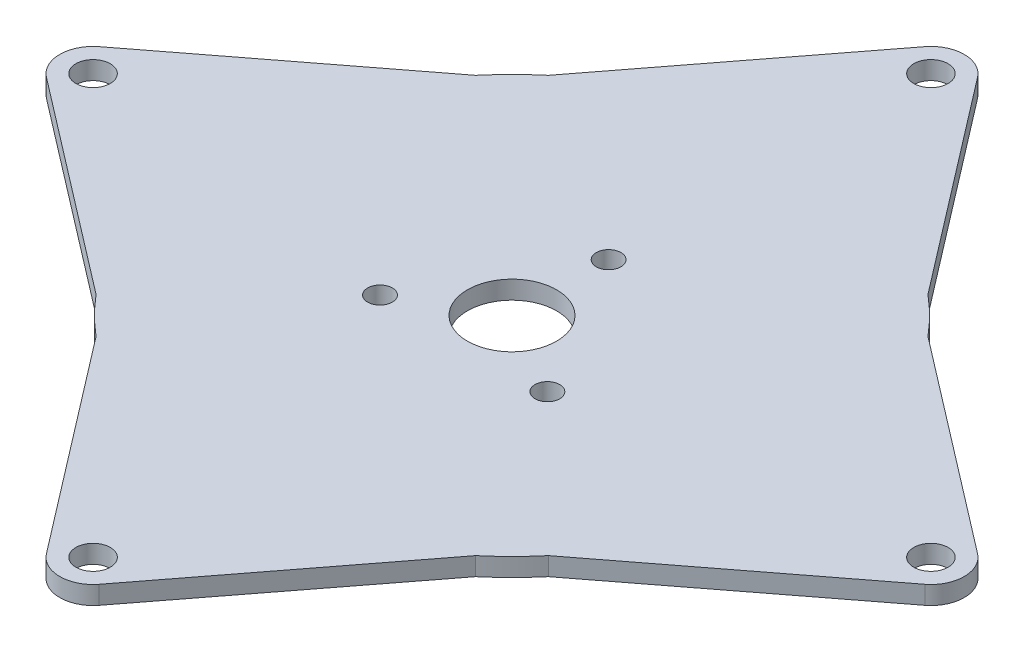
ISO-10303-21;
HEADER;
FILE_DESCRIPTION(('STEP AP214'),'2;1');
FILE_NAME('part.step','',(''),(''),'','','');
FILE_SCHEMA(('AUTOMOTIVE_DESIGN { 1 0 10303 214 1 1 1 1 }'));
ENDSEC;
DATA;
#1=APPLICATION_CONTEXT('core data for automotive mechanical design processes');
#2=APPLICATION_PROTOCOL_DEFINITION('international standard','automotive_design',2000,#1);
#3=PRODUCT_CONTEXT('',#1,'mechanical');
#4=PRODUCT('Part','Part','',(#3));
#5=PRODUCT_RELATED_PRODUCT_CATEGORY('part','',(#4));
#6=PRODUCT_DEFINITION_FORMATION('','',#4);
#7=PRODUCT_DEFINITION_CONTEXT('part definition',#1,'design');
#8=PRODUCT_DEFINITION('design','',#6,#7);
#9=PRODUCT_DEFINITION_SHAPE('','',#8);
#10=(LENGTH_UNIT() NAMED_UNIT(*) SI_UNIT(.MILLI.,.METRE.));
#11=(NAMED_UNIT(*) PLANE_ANGLE_UNIT() SI_UNIT($,.RADIAN.));
#12=(NAMED_UNIT(*) SI_UNIT($,.STERADIAN.) SOLID_ANGLE_UNIT());
#13=UNCERTAINTY_MEASURE_WITH_UNIT(LENGTH_MEASURE(1.E-05),#10,'distance_accuracy_value','');
#14=(GEOMETRIC_REPRESENTATION_CONTEXT(3) GLOBAL_UNCERTAINTY_ASSIGNED_CONTEXT((#13)) GLOBAL_UNIT_ASSIGNED_CONTEXT((#10,
#11,#12)) REPRESENTATION_CONTEXT('',''));
#15=CARTESIAN_POINT('',(0.,0.,0.));
#16=DIRECTION('',(0.,0.,1.));
#17=DIRECTION('',(1.,0.,0.));
#18=AXIS2_PLACEMENT_3D('',#15,#16,#17);
#19=CARTESIAN_POINT('',(21.3024503239143,1.7,-16.3370642064991));
#20=DIRECTION('',(0.793513081858033,0.,-0.60855319317227));
#21=DIRECTION('',(-0.60855319317227,0.,-0.793513081858033));
#22=AXIS2_PLACEMENT_3D('',#19,#20,#21);
#23=PLANE('',#22);
#24=DIRECTION('',(0.60855319317227,0.,0.793513081858033));
#25=VECTOR('',#24,1.);
#26=CARTESIAN_POINT('',(21.3024503239143,0.,-16.3370642064991));
#27=LINE('',#26,#25);
#28=CARTESIAN_POINT('',(2.45989055376033,0.,-40.906514898834));
#29=VERTEX_POINT('',#28);
#30=CARTESIAN_POINT('',(17.6737203830671,0.,-21.0686878523832));
#31=VERTEX_POINT('',#30);
#32=EDGE_CURVE('E251',#29,#31,#27,.T.);
#33=ORIENTED_EDGE('',*,*,#32,.F.);
#34=DIRECTION('',(0.,-1.,0.));
#35=VECTOR('',#34,1.);
#36=CARTESIAN_POINT('',(2.45989055376033,1.7,-40.906514898834));
#37=LINE('',#36,#35);
#38=CARTESIAN_POINT('',(2.45989055376033,1.7,-40.906514898834));
#39=VERTEX_POINT('',#38);
#40=EDGE_CURVE('E11',#39,#29,#37,.T.);
#41=ORIENTED_EDGE('',*,*,#40,.F.);
#42=DIRECTION('',(0.60855319317227,0.,0.793513081858033));
#43=VECTOR('',#42,1.);
#44=CARTESIAN_POINT('',(21.3024503239143,1.7,-16.3370642064991));
#45=LINE('',#44,#43);
#46=CARTESIAN_POINT('',(17.6737203830671,1.7,-21.0686878523832));
#47=VERTEX_POINT('',#46);
#48=EDGE_CURVE('E385',#39,#47,#45,.T.);
#49=ORIENTED_EDGE('',*,*,#48,.T.);
#50=DIRECTION('',(0.,-1.,0.));
#51=VECTOR('',#50,1.);
#52=CARTESIAN_POINT('',(17.6737203830671,1.7,-21.0686878523832));
#53=LINE('',#52,#51);
#54=EDGE_CURVE('E140',#47,#31,#53,.T.);
#55=ORIENTED_EDGE('',*,*,#54,.T.);
#56=EDGE_LOOP('',(#33,#41,#49,#55));
#57=FACE_BOUND('',#56,.T.);
#58=ADVANCED_FACE('F53',(#57),#23,.T.);
#59=CARTESIAN_POINT('',(4.15651699428884E-13,1.7,-39.02));
#60=DIRECTION('',(0.,-1.,0.));
#61=DIRECTION('',(0.,0.,-1.));
#62=AXIS2_PLACEMENT_3D('',#59,#60,#61);
#63=CYLINDRICAL_SURFACE('',#62,3.1);
#64=CARTESIAN_POINT('',(4.15651699428884E-13,0.,-39.02));
#65=DIRECTION('',(0.,1.,0.));
#66=DIRECTION('',(0.,0.,1.));
#67=AXIS2_PLACEMENT_3D('',#64,#65,#66);
#68=CIRCLE('',#67,3.1);
#69=CARTESIAN_POINT('',(-2.45989055375945,0.,-40.9065148988341));
#70=VERTEX_POINT('',#69);
#71=EDGE_CURVE('E255',#29,#70,#68,.T.);
#72=ORIENTED_EDGE('',*,*,#71,.T.);
#73=DIRECTION('',(0.,-1.,0.));
#74=VECTOR('',#73,1.);
#75=CARTESIAN_POINT('',(-2.45989055375945,1.7,-40.9065148988341));
#76=LINE('',#75,#74);
#77=CARTESIAN_POINT('',(-2.45989055375945,1.7,-40.9065148988341));
#78=VERTEX_POINT('',#77);
#79=EDGE_CURVE('E63',#78,#70,#76,.T.);
#80=ORIENTED_EDGE('',*,*,#79,.F.);
#81=CARTESIAN_POINT('',(4.15651699428884E-13,1.7,-39.02));
#82=DIRECTION('',(0.,1.,0.));
#83=DIRECTION('',(0.,0.,1.));
#84=AXIS2_PLACEMENT_3D('',#81,#82,#83);
#85=CIRCLE('',#84,3.1);
#86=EDGE_CURVE('E381',#39,#78,#85,.T.);
#87=ORIENTED_EDGE('',*,*,#86,.F.);
#88=ORIENTED_EDGE('',*,*,#40,.T.);
#89=EDGE_LOOP('',(#72,#80,#87,#88));
#90=FACE_BOUND('',#89,.T.);
#91=ADVANCED_FACE('F365',(#90),#63,.T.);
#92=CARTESIAN_POINT('',(-21.3024503239139,1.7,-16.3370642064996));
#93=DIRECTION('',(-0.793513081858021,0.,-0.608553193172287));
#94=DIRECTION('',(-0.608553193172287,0.,0.79351308185802));
#95=AXIS2_PLACEMENT_3D('',#92,#93,#94);
#96=PLANE('',#95);
#97=DIRECTION('',(0.608553193172287,0.,-0.793513081858021));
#98=VECTOR('',#97,1.);
#99=CARTESIAN_POINT('',(-21.3024503239139,0.,-16.3370642064996));
#100=LINE('',#99,#98);
#101=CARTESIAN_POINT('',(-17.6737203830666,0.,-21.0686878523836));
#102=VERTEX_POINT('',#101);
#103=EDGE_CURVE('E258',#102,#70,#100,.T.);
#104=ORIENTED_EDGE('',*,*,#103,.F.);
#105=DIRECTION('',(0.,-1.,0.));
#106=VECTOR('',#105,1.);
#107=CARTESIAN_POINT('',(-17.6737203830666,1.7,-21.0686878523836));
#108=LINE('',#107,#106);
#109=CARTESIAN_POINT('',(-17.6737203830666,1.7,-21.0686878523836));
#110=VERTEX_POINT('',#109);
#111=EDGE_CURVE('E354',#110,#102,#108,.T.);
#112=ORIENTED_EDGE('',*,*,#111,.F.);
#113=DIRECTION('',(0.608553193172287,0.,-0.793513081858021));
#114=VECTOR('',#113,1.);
#115=CARTESIAN_POINT('',(-21.3024503239139,1.7,-16.3370642064996));
#116=LINE('',#115,#114);
#117=EDGE_CURVE('E362',#110,#78,#116,.T.);
#118=ORIENTED_EDGE('',*,*,#117,.T.);
#119=ORIENTED_EDGE('',*,*,#79,.T.);
#120=EDGE_LOOP('',(#104,#112,#118,#119));
#121=FACE_BOUND('',#120,.T.);
#122=ADVANCED_FACE('F360',(#121),#96,.T.);
#123=CARTESIAN_POINT('',(0.,1.7,0.));
#124=DIRECTION('',(0.,-1.,0.));
#125=DIRECTION('',(0.,0.,-1.));
#126=AXIS2_PLACEMENT_3D('',#123,#124,#125);
#127=CYLINDRICAL_SURFACE('',#126,27.5);
#128=CARTESIAN_POINT('',(0.,0.,0.));
#129=DIRECTION('',(0.,1.,0.));
#130=DIRECTION('',(0.,0.,1.));
#131=AXIS2_PLACEMENT_3D('',#128,#129,#130);
#132=CIRCLE('',#131,27.5);
#133=CARTESIAN_POINT('',(-21.0686878523833,0.,-17.673720383067));
#134=VERTEX_POINT('',#133);
#135=EDGE_CURVE('E262',#102,#134,#132,.T.);
#136=ORIENTED_EDGE('',*,*,#135,.T.);
#137=DIRECTION('',(0.,-1.,0.));
#138=VECTOR('',#137,1.);
#139=CARTESIAN_POINT('',(-21.0686878523833,1.7,-17.673720383067));
#140=LINE('',#139,#138);
#141=CARTESIAN_POINT('',(-21.0686878523833,1.7,-17.673720383067));
#142=VERTEX_POINT('',#141);
#143=EDGE_CURVE('E351',#142,#134,#140,.T.);
#144=ORIENTED_EDGE('',*,*,#143,.F.);
#145=CARTESIAN_POINT('',(0.,1.7,0.));
#146=DIRECTION('',(0.,1.,0.));
#147=DIRECTION('',(0.,0.,1.));
#148=AXIS2_PLACEMENT_3D('',#145,#146,#147);
#149=CIRCLE('',#148,27.5);
#150=EDGE_CURVE('E219',#110,#142,#149,.T.);
#151=ORIENTED_EDGE('',*,*,#150,.F.);
#152=ORIENTED_EDGE('',*,*,#111,.T.);
#153=EDGE_LOOP('',(#136,#144,#151,#152));
#154=FACE_BOUND('',#153,.T.);
#155=ADVANCED_FACE('F374',(#154),#127,.T.);
#156=CARTESIAN_POINT('',(-16.3370642064992,1.7,-21.3024503239142));
#157=DIRECTION('',(-0.608553193172273,0.,-0.793513081858031));
#158=DIRECTION('',(-0.793513081858031,0.,0.608553193172273));
#159=AXIS2_PLACEMENT_3D('',#156,#157,#158);
#160=PLANE('',#159);
#161=DIRECTION('',(0.793513081858031,0.,-0.608553193172273));
#162=VECTOR('',#161,1.);
#163=CARTESIAN_POINT('',(-16.3370642064992,0.,-21.3024503239142));
#164=LINE('',#163,#162);
#165=CARTESIAN_POINT('',(-40.906514898834,0.,-2.45989055376017));
#166=VERTEX_POINT('',#165);
#167=EDGE_CURVE('E266',#166,#134,#164,.T.);
#168=ORIENTED_EDGE('',*,*,#167,.F.);
#169=DIRECTION('',(0.,-1.,0.));
#170=VECTOR('',#169,1.);
#171=CARTESIAN_POINT('',(-40.906514898834,1.7,-2.45989055376017));
#172=LINE('',#171,#170);
#173=CARTESIAN_POINT('',(-40.906514898834,1.7,-2.45989055376017));
#174=VERTEX_POINT('',#173);
#175=EDGE_CURVE('E349',#174,#166,#172,.T.);
#176=ORIENTED_EDGE('',*,*,#175,.F.);
#177=DIRECTION('',(0.793513081858031,0.,-0.608553193172273));
#178=VECTOR('',#177,1.);
#179=CARTESIAN_POINT('',(-16.3370642064992,1.7,-21.3024503239142));
#180=LINE('',#179,#178);
#181=EDGE_CURVE('E379',#174,#142,#180,.T.);
#182=ORIENTED_EDGE('',*,*,#181,.T.);
#183=ORIENTED_EDGE('',*,*,#143,.T.);
#184=EDGE_LOOP('',(#168,#176,#182,#183));
#185=FACE_BOUND('',#184,.T.);
#186=ADVANCED_FACE('F465',(#185),#160,.T.);
#187=CARTESIAN_POINT('',(-39.02,1.7,-2.72475203683318E-13));
#188=DIRECTION('',(0.,-1.,0.));
#189=DIRECTION('',(0.,0.,-1.));
#190=AXIS2_PLACEMENT_3D('',#187,#188,#189);
#191=CYLINDRICAL_SURFACE('',#190,3.1);
#192=CARTESIAN_POINT('',(-39.02,0.,-2.72475203683318E-13));
#193=DIRECTION('',(0.,1.,0.));
#194=DIRECTION('',(0.,0.,1.));
#195=AXIS2_PLACEMENT_3D('',#192,#193,#194);
#196=CIRCLE('',#195,3.1);
#197=CARTESIAN_POINT('',(-40.9065148988341,0.,2.4598905537596));
#198=VERTEX_POINT('',#197);
#199=EDGE_CURVE('E272',#166,#198,#196,.T.);
#200=ORIENTED_EDGE('',*,*,#199,.T.);
#201=DIRECTION('',(0.,-1.,0.));
#202=VECTOR('',#201,1.);
#203=CARTESIAN_POINT('',(-40.9065148988341,1.7,2.4598905537596));
#204=LINE('',#203,#202);
#205=CARTESIAN_POINT('',(-40.9065148988341,1.7,2.4598905537596));
#206=VERTEX_POINT('',#205);
#207=EDGE_CURVE('E347',#206,#198,#204,.T.);
#208=ORIENTED_EDGE('',*,*,#207,.F.);
#209=CARTESIAN_POINT('',(-39.02,1.7,-2.72475203683318E-13));
#210=DIRECTION('',(0.,1.,0.));
#211=DIRECTION('',(0.,0.,1.));
#212=AXIS2_PLACEMENT_3D('',#209,#210,#211);
#213=CIRCLE('',#212,3.1);
#214=EDGE_CURVE('E391',#174,#206,#213,.T.);
#215=ORIENTED_EDGE('',*,*,#214,.F.);
#216=ORIENTED_EDGE('',*,*,#175,.T.);
#217=EDGE_LOOP('',(#200,#208,#215,#216));
#218=FACE_BOUND('',#217,.T.);
#219=ADVANCED_FACE('F468',(#218),#191,.T.);
#220=CARTESIAN_POINT('',(-16.3370642064995,1.7,21.302450323914));
#221=DIRECTION('',(-0.608553193172284,0.,0.793513081858022));
#222=DIRECTION('',(0.793513081858022,0.,0.608553193172284));
#223=AXIS2_PLACEMENT_3D('',#220,#221,#222);
#224=PLANE('',#223);
#225=DIRECTION('',(-0.793513081858022,0.,-0.608553193172284));
#226=VECTOR('',#225,1.);
#227=CARTESIAN_POINT('',(-16.3370642064995,0.,21.302450323914));
#228=LINE('',#227,#226);
#229=CARTESIAN_POINT('',(-21.0686878523835,0.,17.6737203830667));
#230=VERTEX_POINT('',#229);
#231=EDGE_CURVE('E275',#230,#198,#228,.T.);
#232=ORIENTED_EDGE('',*,*,#231,.F.);
#233=DIRECTION('',(0.,-1.,0.));
#234=VECTOR('',#233,1.);
#235=CARTESIAN_POINT('',(-21.0686878523835,1.7,17.6737203830667));
#236=LINE('',#235,#234);
#237=CARTESIAN_POINT('',(-21.0686878523835,1.7,17.6737203830667));
#238=VERTEX_POINT('',#237);
#239=EDGE_CURVE('E345',#238,#230,#236,.T.);
#240=ORIENTED_EDGE('',*,*,#239,.F.);
#241=DIRECTION('',(-0.793513081858022,0.,-0.608553193172284));
#242=VECTOR('',#241,1.);
#243=CARTESIAN_POINT('',(-16.3370642064995,1.7,21.302450323914));
#244=LINE('',#243,#242);
#245=EDGE_CURVE('E393',#238,#206,#244,.T.);
#246=ORIENTED_EDGE('',*,*,#245,.T.);
#247=ORIENTED_EDGE('',*,*,#207,.T.);
#248=EDGE_LOOP('',(#232,#240,#246,#247));
#249=FACE_BOUND('',#248,.T.);
#250=ADVANCED_FACE('F472',(#249),#224,.T.);
#251=CARTESIAN_POINT('',(-17.6737203830669,0.,21.0686878523833));
#252=VERTEX_POINT('',#251);
#253=EDGE_CURVE('E268',#230,#252,#132,.T.);
#254=ORIENTED_EDGE('',*,*,#253,.T.);
#255=DIRECTION('',(0.,-1.,0.));
#256=VECTOR('',#255,1.);
#257=CARTESIAN_POINT('',(-17.6737203830669,1.7,21.0686878523833));
#258=LINE('',#257,#256);
#259=CARTESIAN_POINT('',(-17.6737203830669,1.7,21.0686878523833));
#260=VERTEX_POINT('',#259);
#261=EDGE_CURVE('E343',#260,#252,#258,.T.);
#262=ORIENTED_EDGE('',*,*,#261,.F.);
#263=EDGE_CURVE('E380',#238,#260,#149,.T.);
#264=ORIENTED_EDGE('',*,*,#263,.F.);
#265=ORIENTED_EDGE('',*,*,#239,.T.);
#266=EDGE_LOOP('',(#254,#262,#264,#265));
#267=FACE_BOUND('',#266,.T.);
#268=ADVANCED_FACE('F418',(#267),#127,.T.);
#269=CARTESIAN_POINT('',(-21.3024503239141,1.7,16.3370642064993));
#270=DIRECTION('',(-0.793513081858029,0.,0.608553193172276));
#271=DIRECTION('',(0.608553193172276,0.,0.793513081858029));
#272=AXIS2_PLACEMENT_3D('',#269,#270,#271);
#273=PLANE('',#272);
#274=DIRECTION('',(-0.608553193172276,0.,-0.793513081858029));
#275=VECTOR('',#274,1.);
#276=CARTESIAN_POINT('',(-21.3024503239141,0.,16.3370642064993));
#277=LINE('',#276,#275);
#278=CARTESIAN_POINT('',(-2.45989055376003,0.,40.906514898834));
#279=VERTEX_POINT('',#278);
#280=EDGE_CURVE('E279',#279,#252,#277,.T.);
#281=ORIENTED_EDGE('',*,*,#280,.F.);
#282=DIRECTION('',(0.,-1.,0.));
#283=VECTOR('',#282,1.);
#284=CARTESIAN_POINT('',(-2.45989055376003,1.7,40.906514898834));
#285=LINE('',#284,#283);
#286=CARTESIAN_POINT('',(-2.45989055376003,1.7,40.906514898834));
#287=VERTEX_POINT('',#286);
#288=EDGE_CURVE('E340',#287,#279,#285,.T.);
#289=ORIENTED_EDGE('',*,*,#288,.F.);
#290=DIRECTION('',(-0.608553193172276,0.,-0.793513081858029));
#291=VECTOR('',#290,1.);
#292=CARTESIAN_POINT('',(-21.3024503239141,1.7,16.3370642064993));
#293=LINE('',#292,#291);
#294=EDGE_CURVE('E397',#287,#260,#293,.T.);
#295=ORIENTED_EDGE('',*,*,#294,.T.);
#296=ORIENTED_EDGE('',*,*,#261,.T.);
#297=EDGE_LOOP('',(#281,#289,#295,#296));
#298=FACE_BOUND('',#297,.T.);
#299=ADVANCED_FACE('F422',(#298),#273,.T.);
#300=CARTESIAN_POINT('',(-1.36237601841659E-13,1.7,39.02));
#301=DIRECTION('',(0.,-1.,0.));
#302=DIRECTION('',(0.,0.,-1.));
#303=AXIS2_PLACEMENT_3D('',#300,#301,#302);
#304=CYLINDRICAL_SURFACE('',#303,3.1);
#305=CARTESIAN_POINT('',(-1.36237601841659E-13,0.,39.02));
#306=DIRECTION('',(0.,1.,0.));
#307=DIRECTION('',(0.,0.,1.));
#308=AXIS2_PLACEMENT_3D('',#305,#306,#307);
#309=CIRCLE('',#308,3.1);
#310=CARTESIAN_POINT('',(2.45989055375975,0.,40.9065148988341));
#311=VERTEX_POINT('',#310);
#312=EDGE_CURVE('E283',#279,#311,#309,.T.);
#313=ORIENTED_EDGE('',*,*,#312,.T.);
#314=DIRECTION('',(0.,-1.,0.));
#315=VECTOR('',#314,1.);
#316=CARTESIAN_POINT('',(2.45989055375975,1.7,40.9065148988341));
#317=LINE('',#316,#315);
#318=CARTESIAN_POINT('',(2.45989055375975,1.7,40.9065148988341));
#319=VERTEX_POINT('',#318);
#320=EDGE_CURVE('E337',#319,#311,#317,.T.);
#321=ORIENTED_EDGE('',*,*,#320,.F.);
#322=CARTESIAN_POINT('',(-1.36237601841659E-13,1.7,39.02));
#323=DIRECTION('',(0.,1.,0.));
#324=DIRECTION('',(0.,0.,1.));
#325=AXIS2_PLACEMENT_3D('',#322,#323,#324);
#326=CIRCLE('',#325,3.1);
#327=EDGE_CURVE('E401',#287,#319,#326,.T.);
#328=ORIENTED_EDGE('',*,*,#327,.F.);
#329=ORIENTED_EDGE('',*,*,#288,.T.);
#330=EDGE_LOOP('',(#313,#321,#328,#329));
#331=FACE_BOUND('',#330,.T.);
#332=ADVANCED_FACE('F427',(#331),#304,.T.);
#333=CARTESIAN_POINT('',(21.302450323914,1.7,16.3370642064994));
#334=DIRECTION('',(0.793513081858025,0.,0.608553193172281));
#335=DIRECTION('',(0.608553193172281,0.,-0.793513081858025));
#336=AXIS2_PLACEMENT_3D('',#333,#334,#335);
#337=PLANE('',#336);
#338=DIRECTION('',(-0.608553193172281,0.,0.793513081858025));
#339=VECTOR('',#338,1.);
#340=CARTESIAN_POINT('',(21.302450323914,0.,16.3370642064994));
#341=LINE('',#340,#339);
#342=CARTESIAN_POINT('',(17.6737203830668,0.,21.0686878523835));
#343=VERTEX_POINT('',#342);
#344=EDGE_CURVE('E287',#343,#311,#341,.T.);
#345=ORIENTED_EDGE('',*,*,#344,.F.);
#346=DIRECTION('',(0.,-1.,0.));
#347=VECTOR('',#346,1.);
#348=CARTESIAN_POINT('',(17.6737203830668,1.7,21.0686878523835));
#349=LINE('',#348,#347);
#350=CARTESIAN_POINT('',(17.6737203830668,1.7,21.0686878523835));
#351=VERTEX_POINT('',#350);
#352=EDGE_CURVE('E335',#351,#343,#349,.T.);
#353=ORIENTED_EDGE('',*,*,#352,.F.);
#354=DIRECTION('',(-0.608553193172281,0.,0.793513081858025));
#355=VECTOR('',#354,1.);
#356=CARTESIAN_POINT('',(21.302450323914,1.7,16.3370642064994));
#357=LINE('',#356,#355);
#358=EDGE_CURVE('E404',#351,#319,#357,.T.);
#359=ORIENTED_EDGE('',*,*,#358,.T.);
#360=ORIENTED_EDGE('',*,*,#320,.T.);
#361=EDGE_LOOP('',(#345,#353,#359,#360));
#362=FACE_BOUND('',#361,.T.);
#363=ADVANCED_FACE('F430',(#362),#337,.T.);
#364=CARTESIAN_POINT('',(21.0686878523834,0.,17.6737203830668));
#365=VERTEX_POINT('',#364);
#366=EDGE_CURVE('E291',#343,#365,#132,.T.);
#367=ORIENTED_EDGE('',*,*,#366,.T.);
#368=DIRECTION('',(0.,-1.,0.));
#369=VECTOR('',#368,1.);
#370=CARTESIAN_POINT('',(21.0686878523834,1.7,17.6737203830668));
#371=LINE('',#370,#369);
#372=CARTESIAN_POINT('',(21.0686878523834,1.7,17.6737203830668));
#373=VERTEX_POINT('',#372);
#374=EDGE_CURVE('E333',#373,#365,#371,.T.);
#375=ORIENTED_EDGE('',*,*,#374,.F.);
#376=EDGE_CURVE('E218',#351,#373,#149,.T.);
#377=ORIENTED_EDGE('',*,*,#376,.F.);
#378=ORIENTED_EDGE('',*,*,#352,.T.);
#379=EDGE_LOOP('',(#367,#375,#377,#378));
#380=FACE_BOUND('',#379,.T.);
#381=ADVANCED_FACE('F434',(#380),#127,.T.);
#382=CARTESIAN_POINT('',(16.3370642064993,1.7,21.3024503239141));
#383=DIRECTION('',(0.608553193172279,0.,0.793513081858027));
#384=DIRECTION('',(0.793513081858027,0.,-0.608553193172279));
#385=AXIS2_PLACEMENT_3D('',#382,#383,#384);
#386=PLANE('',#385);
#387=DIRECTION('',(-0.793513081858027,0.,0.608553193172279));
#388=VECTOR('',#387,1.);
#389=CARTESIAN_POINT('',(16.3370642064993,0.,21.3024503239141));
#390=LINE('',#389,#388);
#391=CARTESIAN_POINT('',(40.9065148988341,0.,2.45989055375989));
#392=VERTEX_POINT('',#391);
#393=EDGE_CURVE('E292',#392,#365,#390,.T.);
#394=ORIENTED_EDGE('',*,*,#393,.F.);
#395=DIRECTION('',(0.,-1.,0.));
#396=VECTOR('',#395,1.);
#397=CARTESIAN_POINT('',(40.9065148988341,1.7,2.45989055375989));
#398=LINE('',#397,#396);
#399=CARTESIAN_POINT('',(40.9065148988341,1.7,2.45989055375989));
#400=VERTEX_POINT('',#399);
#401=EDGE_CURVE('E208',#400,#392,#398,.T.);
#402=ORIENTED_EDGE('',*,*,#401,.F.);
#403=DIRECTION('',(-0.793513081858027,0.,0.608553193172279));
#404=VECTOR('',#403,1.);
#405=CARTESIAN_POINT('',(16.3370642064993,1.7,21.3024503239141));
#406=LINE('',#405,#404);
#407=EDGE_CURVE('E195',#400,#373,#406,.T.);
#408=ORIENTED_EDGE('',*,*,#407,.T.);
#409=ORIENTED_EDGE('',*,*,#374,.T.);
#410=EDGE_LOOP('',(#394,#402,#408,#409));
#411=FACE_BOUND('',#410,.T.);
#412=ADVANCED_FACE('F436',(#411),#386,.T.);
#413=CARTESIAN_POINT('',(39.02,1.7,0.));
#414=DIRECTION('',(0.,-1.,0.));
#415=DIRECTION('',(0.,0.,-1.));
#416=AXIS2_PLACEMENT_3D('',#413,#414,#415);
#417=CYLINDRICAL_SURFACE('',#416,3.1);
#418=CARTESIAN_POINT('',(39.02,0.,0.));
#419=DIRECTION('',(0.,1.,0.));
#420=DIRECTION('',(0.,0.,1.));
#421=AXIS2_PLACEMENT_3D('',#418,#419,#420);
#422=CIRCLE('',#421,3.1);
#423=CARTESIAN_POINT('',(40.9065148988341,0.,-2.45989055375988));
#424=VERTEX_POINT('',#423);
#425=EDGE_CURVE('E203',#392,#424,#422,.T.);
#426=ORIENTED_EDGE('',*,*,#425,.T.);
#427=DIRECTION('',(0.,-1.,0.));
#428=VECTOR('',#427,1.);
#429=CARTESIAN_POINT('',(40.9065148988341,1.7,-2.45989055375988));
#430=LINE('',#429,#428);
#431=CARTESIAN_POINT('',(40.9065148988341,1.7,-2.45989055375988));
#432=VERTEX_POINT('',#431);
#433=EDGE_CURVE('E200',#432,#424,#430,.T.);
#434=ORIENTED_EDGE('',*,*,#433,.F.);
#435=CARTESIAN_POINT('',(39.02,1.7,0.));
#436=DIRECTION('',(0.,1.,0.));
#437=DIRECTION('',(0.,0.,1.));
#438=AXIS2_PLACEMENT_3D('',#435,#436,#437);
#439=CIRCLE('',#438,3.1);
#440=EDGE_CURVE('E188',#400,#432,#439,.T.);
#441=ORIENTED_EDGE('',*,*,#440,.F.);
#442=ORIENTED_EDGE('',*,*,#401,.T.);
#443=EDGE_LOOP('',(#426,#434,#441,#442));
#444=FACE_BOUND('',#443,.T.);
#445=ADVANCED_FACE('F201',(#444),#417,.T.);
#446=CARTESIAN_POINT('',(16.3370642064993,1.7,-21.3024503239141));
#447=DIRECTION('',(0.608553193172278,0.,-0.793513081858027));
#448=DIRECTION('',(-0.793513081858027,0.,-0.608553193172278));
#449=AXIS2_PLACEMENT_3D('',#446,#447,#448);
#450=PLANE('',#449);
#451=DIRECTION('',(0.793513081858027,0.,0.608553193172278));
#452=VECTOR('',#451,1.);
#453=CARTESIAN_POINT('',(16.3370642064993,0.,-21.3024503239141));
#454=LINE('',#453,#452);
#455=CARTESIAN_POINT('',(21.0686878523834,0.,-17.6737203830668));
#456=VERTEX_POINT('',#455);
#457=EDGE_CURVE('E298',#456,#424,#454,.T.);
#458=ORIENTED_EDGE('',*,*,#457,.F.);
#459=DIRECTION('',(0.,-1.,0.));
#460=VECTOR('',#459,1.);
#461=CARTESIAN_POINT('',(21.0686878523834,1.7,-17.6737203830668));
#462=LINE('',#461,#460);
#463=CARTESIAN_POINT('',(21.0686878523834,1.7,-17.6737203830668));
#464=VERTEX_POINT('',#463);
#465=EDGE_CURVE('E133',#464,#456,#462,.T.);
#466=ORIENTED_EDGE('',*,*,#465,.F.);
#467=DIRECTION('',(0.793513081858027,0.,0.608553193172278));
#468=VECTOR('',#467,1.);
#469=CARTESIAN_POINT('',(16.3370642064993,1.7,-21.3024503239141));
#470=LINE('',#469,#468);
#471=EDGE_CURVE('E193',#464,#432,#470,.T.);
#472=ORIENTED_EDGE('',*,*,#471,.T.);
#473=ORIENTED_EDGE('',*,*,#433,.T.);
#474=EDGE_LOOP('',(#458,#466,#472,#473));
#475=FACE_BOUND('',#474,.T.);
#476=ADVANCED_FACE('F210',(#475),#450,.T.);
#477=CARTESIAN_POINT('',(-1.36237601841659E-13,1.7,39.02));
#478=DIRECTION('',(0.,-1.,0.));
#479=DIRECTION('',(0.,0.,-1.));
#480=AXIS2_PLACEMENT_3D('',#477,#478,#479);
#481=CYLINDRICAL_SURFACE('',#480,1.6);
#482=CARTESIAN_POINT('',(-1.36237601841659E-13,1.7,39.02));
#483=DIRECTION('',(0.,1.,0.));
#484=DIRECTION('',(0.,0.,1.));
#485=AXIS2_PLACEMENT_3D('',#482,#483,#484);
#486=CIRCLE('',#485,1.6);
#487=CARTESIAN_POINT('',(-1.36237601841659E-13,1.7,40.62));
#488=VERTEX_POINT('',#487);
#489=EDGE_CURVE('E241',#488,#488,#486,.T.);
#490=ORIENTED_EDGE('',*,*,#489,.T.);
#491=EDGE_LOOP('',(#490));
#492=FACE_BOUND('',#491,.T.);
#493=CARTESIAN_POINT('',(-1.36237601841659E-13,0.,39.02));
#494=DIRECTION('',(0.,1.,0.));
#495=DIRECTION('',(0.,0.,1.));
#496=AXIS2_PLACEMENT_3D('',#493,#494,#495);
#497=CIRCLE('',#496,1.6);
#498=CARTESIAN_POINT('',(-1.36237601841659E-13,0.,40.62));
#499=VERTEX_POINT('',#498);
#500=EDGE_CURVE('E321',#499,#499,#497,.T.);
#501=ORIENTED_EDGE('',*,*,#500,.F.);
#502=EDGE_LOOP('',(#501));
#503=FACE_BOUND('',#502,.T.);
#504=ADVANCED_FACE('F489',(#492,#503),#481,.F.);
#505=CARTESIAN_POINT('',(39.02,1.7,0.));
#506=DIRECTION('',(0.,-1.,0.));
#507=DIRECTION('',(0.,0.,-1.));
#508=AXIS2_PLACEMENT_3D('',#505,#506,#507);
#509=CYLINDRICAL_SURFACE('',#508,1.60000000000001);
#510=CARTESIAN_POINT('',(39.02,1.7,0.));
#511=DIRECTION('',(0.,1.,0.));
#512=DIRECTION('',(0.,0.,1.));
#513=AXIS2_PLACEMENT_3D('',#510,#511,#512);
#514=CIRCLE('',#513,1.60000000000001);
#515=CARTESIAN_POINT('',(39.02,1.7,1.60000000000001));
#516=VERTEX_POINT('',#515);
#517=EDGE_CURVE('E237',#516,#516,#514,.T.);
#518=ORIENTED_EDGE('',*,*,#517,.T.);
#519=EDGE_LOOP('',(#518));
#520=FACE_BOUND('',#519,.T.);
#521=CARTESIAN_POINT('',(39.02,0.,0.));
#522=DIRECTION('',(0.,1.,0.));
#523=DIRECTION('',(0.,0.,1.));
#524=AXIS2_PLACEMENT_3D('',#521,#522,#523);
#525=CIRCLE('',#524,1.60000000000001);
#526=CARTESIAN_POINT('',(39.02,0.,1.60000000000001));
#527=VERTEX_POINT('',#526);
#528=EDGE_CURVE('E317',#527,#527,#525,.T.);
#529=ORIENTED_EDGE('',*,*,#528,.F.);
#530=EDGE_LOOP('',(#529));
#531=FACE_BOUND('',#530,.T.);
#532=ADVANCED_FACE('F507',(#520,#531),#509,.F.);
#533=CARTESIAN_POINT('',(0.,1.7,-9.));
#534=DIRECTION('',(0.,-1.,0.));
#535=DIRECTION('',(0.,0.,-1.));
#536=AXIS2_PLACEMENT_3D('',#533,#534,#535);
#537=CYLINDRICAL_SURFACE('',#536,1.15);
#538=CARTESIAN_POINT('',(0.,1.7,-9.));
#539=DIRECTION('',(0.,1.,0.));
#540=DIRECTION('',(0.,0.,1.));
#541=AXIS2_PLACEMENT_3D('',#538,#539,#540);
#542=CIRCLE('',#541,1.15);
#543=CARTESIAN_POINT('',(0.,1.7,-7.85));
#544=VERTEX_POINT('',#543);
#545=EDGE_CURVE('E233',#544,#544,#542,.T.);
#546=ORIENTED_EDGE('',*,*,#545,.T.);
#547=EDGE_LOOP('',(#546));
#548=FACE_BOUND('',#547,.T.);
#549=CARTESIAN_POINT('',(0.,0.,-9.));
#550=DIRECTION('',(0.,1.,0.));
#551=DIRECTION('',(0.,0.,1.));
#552=AXIS2_PLACEMENT_3D('',#549,#550,#551);
#553=CIRCLE('',#552,1.15);
#554=CARTESIAN_POINT('',(0.,0.,-7.85));
#555=VERTEX_POINT('',#554);
#556=EDGE_CURVE('E313',#555,#555,#553,.T.);
#557=ORIENTED_EDGE('',*,*,#556,.F.);
#558=EDGE_LOOP('',(#557));
#559=FACE_BOUND('',#558,.T.);
#560=ADVANCED_FACE('F504',(#548,#559),#537,.F.);
#561=CARTESIAN_POINT('',(7.79422863405993,1.7,4.50000000000004));
#562=DIRECTION('',(0.,-1.,0.));
#563=DIRECTION('',(0.,0.,-1.));
#564=AXIS2_PLACEMENT_3D('',#561,#562,#563);
#565=CYLINDRICAL_SURFACE('',#564,1.15);
#566=CARTESIAN_POINT('',(7.79422863405993,1.7,4.50000000000004));
#567=DIRECTION('',(0.,1.,0.));
#568=DIRECTION('',(0.,0.,1.));
#569=AXIS2_PLACEMENT_3D('',#566,#567,#568);
#570=CIRCLE('',#569,1.15);
#571=CARTESIAN_POINT('',(7.79422863405993,1.7,5.65000000000004));
#572=VERTEX_POINT('',#571);
#573=EDGE_CURVE('E229',#572,#572,#570,.T.);
#574=ORIENTED_EDGE('',*,*,#573,.T.);
#575=EDGE_LOOP('',(#574));
#576=FACE_BOUND('',#575,.T.);
#577=CARTESIAN_POINT('',(7.79422863405993,0.,4.50000000000004));
#578=DIRECTION('',(0.,1.,0.));
#579=DIRECTION('',(0.,0.,1.));
#580=AXIS2_PLACEMENT_3D('',#577,#578,#579);
#581=CIRCLE('',#580,1.15);
#582=CARTESIAN_POINT('',(7.79422863405993,0.,5.65000000000004));
#583=VERTEX_POINT('',#582);
#584=EDGE_CURVE('E309',#583,#583,#581,.T.);
#585=ORIENTED_EDGE('',*,*,#584,.F.);
#586=EDGE_LOOP('',(#585));
#587=FACE_BOUND('',#586,.T.);
#588=ADVANCED_FACE('F500',(#576,#587),#565,.F.);
#589=CARTESIAN_POINT('',(-7.79422863405999,1.7,4.49999999999993));
#590=DIRECTION('',(0.,-1.,0.));
#591=DIRECTION('',(0.,0.,-1.));
#592=AXIS2_PLACEMENT_3D('',#589,#590,#591);
#593=CYLINDRICAL_SURFACE('',#592,1.15);
#594=CARTESIAN_POINT('',(-7.79422863405999,1.7,4.49999999999993));
#595=DIRECTION('',(0.,1.,0.));
#596=DIRECTION('',(0.,0.,1.));
#597=AXIS2_PLACEMENT_3D('',#594,#595,#596);
#598=CIRCLE('',#597,1.15);
#599=CARTESIAN_POINT('',(-7.79422863405999,1.7,5.64999999999993));
#600=VERTEX_POINT('',#599);
#601=EDGE_CURVE('E225',#600,#600,#598,.T.);
#602=ORIENTED_EDGE('',*,*,#601,.T.);
#603=EDGE_LOOP('',(#602));
#604=FACE_BOUND('',#603,.T.);
#605=CARTESIAN_POINT('',(-7.79422863405999,0.,4.49999999999993));
#606=DIRECTION('',(0.,1.,0.));
#607=DIRECTION('',(0.,0.,1.));
#608=AXIS2_PLACEMENT_3D('',#605,#606,#607);
#609=CIRCLE('',#608,1.15);
#610=CARTESIAN_POINT('',(-7.79422863405999,0.,5.64999999999993));
#611=VERTEX_POINT('',#610);
#612=EDGE_CURVE('E305',#611,#611,#609,.T.);
#613=ORIENTED_EDGE('',*,*,#612,.F.);
#614=EDGE_LOOP('',(#613));
#615=FACE_BOUND('',#614,.T.);
#616=ADVANCED_FACE('F496',(#604,#615),#593,.F.);
#617=CARTESIAN_POINT('',(0.,1.7,0.));
#618=DIRECTION('',(0.,-1.,0.));
#619=DIRECTION('',(0.,0.,-1.));
#620=AXIS2_PLACEMENT_3D('',#617,#618,#619);
#621=CYLINDRICAL_SURFACE('',#620,4.15);
#622=CARTESIAN_POINT('',(0.,1.7,0.));
#623=DIRECTION('',(0.,1.,0.));
#624=DIRECTION('',(0.,0.,1.));
#625=AXIS2_PLACEMENT_3D('',#622,#623,#624);
#626=CIRCLE('',#625,4.15);
#627=CARTESIAN_POINT('',(0.,1.7,4.15));
#628=VERTEX_POINT('',#627);
#629=EDGE_CURVE('E216',#628,#628,#626,.T.);
#630=ORIENTED_EDGE('',*,*,#629,.T.);
#631=EDGE_LOOP('',(#630));
#632=FACE_BOUND('',#631,.T.);
#633=CARTESIAN_POINT('',(0.,0.,0.));
#634=DIRECTION('',(0.,1.,0.));
#635=DIRECTION('',(0.,0.,1.));
#636=AXIS2_PLACEMENT_3D('',#633,#634,#635);
#637=CIRCLE('',#636,4.15);
#638=CARTESIAN_POINT('',(0.,0.,4.15));
#639=VERTEX_POINT('',#638);
#640=EDGE_CURVE('E301',#639,#639,#637,.T.);
#641=ORIENTED_EDGE('',*,*,#640,.F.);
#642=EDGE_LOOP('',(#641));
#643=FACE_BOUND('',#642,.T.);
#644=ADVANCED_FACE('F493',(#632,#643),#621,.F.);
#645=EDGE_CURVE('E267',#456,#31,#132,.T.);
#646=ORIENTED_EDGE('',*,*,#645,.T.);
#647=ORIENTED_EDGE('',*,*,#54,.F.);
#648=EDGE_CURVE('E74',#464,#47,#149,.T.);
#649=ORIENTED_EDGE('',*,*,#648,.F.);
#650=ORIENTED_EDGE('',*,*,#465,.T.);
#651=EDGE_LOOP('',(#646,#647,#649,#650));
#652=FACE_BOUND('',#651,.T.);
#653=ADVANCED_FACE('F490',(#652),#127,.T.);
#654=CARTESIAN_POINT('',(4.15651699428884E-13,1.7,-39.02));
#655=DIRECTION('',(0.,-1.,0.));
#656=DIRECTION('',(0.,0.,-1.));
#657=AXIS2_PLACEMENT_3D('',#654,#655,#656);
#658=CYLINDRICAL_SURFACE('',#657,1.60000000000001);
#659=CARTESIAN_POINT('',(4.15651699428884E-13,1.7,-39.02));
#660=DIRECTION('',(0.,1.,0.));
#661=DIRECTION('',(0.,0.,1.));
#662=AXIS2_PLACEMENT_3D('',#659,#660,#661);
#663=CIRCLE('',#662,1.60000000000001);
#664=CARTESIAN_POINT('',(4.15651699428884E-13,1.7,-37.42));
#665=VERTEX_POINT('',#664);
#666=EDGE_CURVE('E328',#665,#665,#663,.T.);
#667=ORIENTED_EDGE('',*,*,#666,.T.);
#668=EDGE_LOOP('',(#667));
#669=FACE_BOUND('',#668,.T.);
#670=CARTESIAN_POINT('',(4.15651699428884E-13,0.,-39.02));
#671=DIRECTION('',(0.,1.,0.));
#672=DIRECTION('',(0.,0.,1.));
#673=AXIS2_PLACEMENT_3D('',#670,#671,#672);
#674=CIRCLE('',#673,1.60000000000001);
#675=CARTESIAN_POINT('',(4.15651699428884E-13,0.,-37.42));
#676=VERTEX_POINT('',#675);
#677=EDGE_CURVE('E248',#676,#676,#674,.T.);
#678=ORIENTED_EDGE('',*,*,#677,.F.);
#679=EDGE_LOOP('',(#678));
#680=FACE_BOUND('',#679,.T.);
#681=ADVANCED_FACE('F55',(#669,#680),#658,.F.);
#682=CARTESIAN_POINT('',(-39.02,1.7,-2.72475203683318E-13));
#683=DIRECTION('',(0.,-1.,0.));
#684=DIRECTION('',(0.,0.,-1.));
#685=AXIS2_PLACEMENT_3D('',#682,#683,#684);
#686=CYLINDRICAL_SURFACE('',#685,1.6);
#687=CARTESIAN_POINT('',(-39.02,1.7,-2.72475203683318E-13));
#688=DIRECTION('',(0.,1.,0.));
#689=DIRECTION('',(0.,0.,1.));
#690=AXIS2_PLACEMENT_3D('',#687,#688,#689);
#691=CIRCLE('',#690,1.6);
#692=CARTESIAN_POINT('',(-39.02,1.7,1.59999999999973));
#693=VERTEX_POINT('',#692);
#694=EDGE_CURVE('E245',#693,#693,#691,.T.);
#695=ORIENTED_EDGE('',*,*,#694,.T.);
#696=EDGE_LOOP('',(#695));
#697=FACE_BOUND('',#696,.T.);
#698=CARTESIAN_POINT('',(-39.02,0.,-2.72475203683318E-13));
#699=DIRECTION('',(0.,1.,0.));
#700=DIRECTION('',(0.,0.,1.));
#701=AXIS2_PLACEMENT_3D('',#698,#699,#700);
#702=CIRCLE('',#701,1.6);
#703=CARTESIAN_POINT('',(-39.02,0.,1.59999999999973));
#704=VERTEX_POINT('',#703);
#705=EDGE_CURVE('E325',#704,#704,#702,.T.);
#706=ORIENTED_EDGE('',*,*,#705,.F.);
#707=EDGE_LOOP('',(#706));
#708=FACE_BOUND('',#707,.T.);
#709=ADVANCED_FACE('F447',(#697,#708),#686,.F.);
#710=CARTESIAN_POINT('',(0.,1.7,0.));
#711=DIRECTION('',(0.,1.,0.));
#712=DIRECTION('',(0.,0.,1.));
#713=AXIS2_PLACEMENT_3D('',#710,#711,#712);
#714=PLANE('',#713);
#715=ORIENTED_EDGE('',*,*,#666,.F.);
#716=EDGE_LOOP('',(#715));
#717=FACE_BOUND('',#716,.T.);
#718=ORIENTED_EDGE('',*,*,#48,.F.);
#719=ORIENTED_EDGE('',*,*,#86,.T.);
#720=ORIENTED_EDGE('',*,*,#117,.F.);
#721=ORIENTED_EDGE('',*,*,#150,.T.);
#722=ORIENTED_EDGE('',*,*,#181,.F.);
#723=ORIENTED_EDGE('',*,*,#214,.T.);
#724=ORIENTED_EDGE('',*,*,#245,.F.);
#725=ORIENTED_EDGE('',*,*,#263,.T.);
#726=ORIENTED_EDGE('',*,*,#294,.F.);
#727=ORIENTED_EDGE('',*,*,#327,.T.);
#728=ORIENTED_EDGE('',*,*,#358,.F.);
#729=ORIENTED_EDGE('',*,*,#376,.T.);
#730=ORIENTED_EDGE('',*,*,#407,.F.);
#731=ORIENTED_EDGE('',*,*,#440,.T.);
#732=ORIENTED_EDGE('',*,*,#471,.F.);
#733=ORIENTED_EDGE('',*,*,#648,.T.);
#734=EDGE_LOOP('',(#718,#719,#720,#721,#722,#723,#724,#725,#726,#727,#728,#729,#730,#731,#732,#733));
#735=FACE_BOUND('',#734,.T.);
#736=ORIENTED_EDGE('',*,*,#629,.F.);
#737=EDGE_LOOP('',(#736));
#738=FACE_BOUND('',#737,.T.);
#739=ORIENTED_EDGE('',*,*,#601,.F.);
#740=EDGE_LOOP('',(#739));
#741=FACE_BOUND('',#740,.T.);
#742=ORIENTED_EDGE('',*,*,#573,.F.);
#743=EDGE_LOOP('',(#742));
#744=FACE_BOUND('',#743,.T.);
#745=ORIENTED_EDGE('',*,*,#545,.F.);
#746=EDGE_LOOP('',(#745));
#747=FACE_BOUND('',#746,.T.);
#748=ORIENTED_EDGE('',*,*,#517,.F.);
#749=EDGE_LOOP('',(#748));
#750=FACE_BOUND('',#749,.T.);
#751=ORIENTED_EDGE('',*,*,#489,.F.);
#752=EDGE_LOOP('',(#751));
#753=FACE_BOUND('',#752,.T.);
#754=ORIENTED_EDGE('',*,*,#694,.F.);
#755=EDGE_LOOP('',(#754));
#756=FACE_BOUND('',#755,.T.);
#757=ADVANCED_FACE('F190',(#717,#735,#738,#741,#744,#747,#750,#753,#756),#714,.T.);
#758=CARTESIAN_POINT('',(0.,0.,0.));
#759=DIRECTION('',(0.,1.,0.));
#760=DIRECTION('',(0.,0.,1.));
#761=AXIS2_PLACEMENT_3D('',#758,#759,#760);
#762=PLANE('',#761);
#763=ORIENTED_EDGE('',*,*,#677,.T.);
#764=EDGE_LOOP('',(#763));
#765=FACE_BOUND('',#764,.T.);
#766=ORIENTED_EDGE('',*,*,#32,.T.);
#767=ORIENTED_EDGE('',*,*,#645,.F.);
#768=ORIENTED_EDGE('',*,*,#457,.T.);
#769=ORIENTED_EDGE('',*,*,#425,.F.);
#770=ORIENTED_EDGE('',*,*,#393,.T.);
#771=ORIENTED_EDGE('',*,*,#366,.F.);
#772=ORIENTED_EDGE('',*,*,#344,.T.);
#773=ORIENTED_EDGE('',*,*,#312,.F.);
#774=ORIENTED_EDGE('',*,*,#280,.T.);
#775=ORIENTED_EDGE('',*,*,#253,.F.);
#776=ORIENTED_EDGE('',*,*,#231,.T.);
#777=ORIENTED_EDGE('',*,*,#199,.F.);
#778=ORIENTED_EDGE('',*,*,#167,.T.);
#779=ORIENTED_EDGE('',*,*,#135,.F.);
#780=ORIENTED_EDGE('',*,*,#103,.T.);
#781=ORIENTED_EDGE('',*,*,#71,.F.);
#782=EDGE_LOOP('',(#766,#767,#768,#769,#770,#771,#772,#773,#774,#775,#776,#777,#778,#779,#780,#781));
#783=FACE_BOUND('',#782,.T.);
#784=ORIENTED_EDGE('',*,*,#640,.T.);
#785=EDGE_LOOP('',(#784));
#786=FACE_BOUND('',#785,.T.);
#787=ORIENTED_EDGE('',*,*,#612,.T.);
#788=EDGE_LOOP('',(#787));
#789=FACE_BOUND('',#788,.T.);
#790=ORIENTED_EDGE('',*,*,#584,.T.);
#791=EDGE_LOOP('',(#790));
#792=FACE_BOUND('',#791,.T.);
#793=ORIENTED_EDGE('',*,*,#556,.T.);
#794=EDGE_LOOP('',(#793));
#795=FACE_BOUND('',#794,.T.);
#796=ORIENTED_EDGE('',*,*,#528,.T.);
#797=EDGE_LOOP('',(#796));
#798=FACE_BOUND('',#797,.T.);
#799=ORIENTED_EDGE('',*,*,#500,.T.);
#800=EDGE_LOOP('',(#799));
#801=FACE_BOUND('',#800,.T.);
#802=ORIENTED_EDGE('',*,*,#705,.T.);
#803=EDGE_LOOP('',(#802));
#804=FACE_BOUND('',#803,.T.);
#805=ADVANCED_FACE('F368',(#765,#783,#786,#789,#792,#795,#798,#801,#804),#762,.F.);
#806=CLOSED_SHELL('',(#58,#91,#122,#155,#186,#219,#250,#268,#299,#332,#363,#381,#412,#445,#476,
#504,#532,#560,#588,#616,#644,#653,#681,#709,#757,#805));
#807=MANIFOLD_SOLID_BREP('B2',#806);
#808=ADVANCED_BREP_SHAPE_REPRESENTATION('',(#18,#807),#14);
#809=SHAPE_DEFINITION_REPRESENTATION(#9,#808);
ENDSEC;
END-ISO-10303-21;
